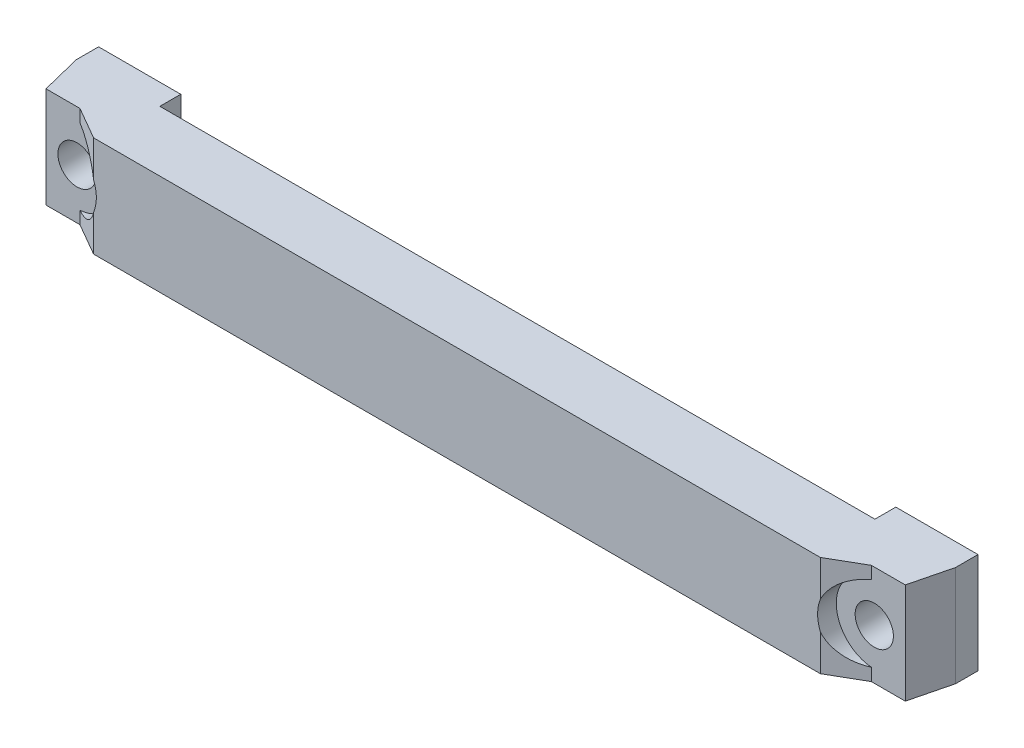
ISO-10303-21;
HEADER;
FILE_DESCRIPTION(('STEP AP214'),'2;1');
FILE_NAME('part.step','',(''),(''),'','','');
FILE_SCHEMA(('AUTOMOTIVE_DESIGN { 1 0 10303 214 1 1 1 1 }'));
ENDSEC;
DATA;
#1=APPLICATION_CONTEXT('core data for automotive mechanical design processes');
#2=APPLICATION_PROTOCOL_DEFINITION('international standard','automotive_design',2000,#1);
#3=PRODUCT_CONTEXT('',#1,'mechanical');
#4=PRODUCT('Part','Part','',(#3));
#5=PRODUCT_RELATED_PRODUCT_CATEGORY('part','',(#4));
#6=PRODUCT_DEFINITION_FORMATION('','',#4);
#7=PRODUCT_DEFINITION_CONTEXT('part definition',#1,'design');
#8=PRODUCT_DEFINITION('design','',#6,#7);
#9=PRODUCT_DEFINITION_SHAPE('','',#8);
#10=(LENGTH_UNIT() NAMED_UNIT(*) SI_UNIT(.MILLI.,.METRE.));
#11=(NAMED_UNIT(*) PLANE_ANGLE_UNIT() SI_UNIT($,.RADIAN.));
#12=(NAMED_UNIT(*) SI_UNIT($,.STERADIAN.) SOLID_ANGLE_UNIT());
#13=UNCERTAINTY_MEASURE_WITH_UNIT(LENGTH_MEASURE(1.E-05),#10,'distance_accuracy_value','');
#14=(GEOMETRIC_REPRESENTATION_CONTEXT(3) GLOBAL_UNCERTAINTY_ASSIGNED_CONTEXT((#13)) GLOBAL_UNIT_ASSIGNED_CONTEXT((#10,
#11,#12)) REPRESENTATION_CONTEXT('',''));
#15=CARTESIAN_POINT('',(0.,0.,0.));
#16=DIRECTION('',(0.,0.,1.));
#17=DIRECTION('',(1.,0.,0.));
#18=AXIS2_PLACEMENT_3D('',#15,#16,#17);
#19=CARTESIAN_POINT('',(0.,0.,-2.075));
#20=DIRECTION('',(0.,0.,-1.));
#21=DIRECTION('',(-1.,0.,0.));
#22=AXIS2_PLACEMENT_3D('',#19,#20,#21);
#23=PLANE('',#22);
#24=DIRECTION('',(0.,1.,0.));
#25=VECTOR('',#24,1.);
#26=CARTESIAN_POINT('',(0.,0.,-2.075));
#27=LINE('',#26,#25);
#28=CARTESIAN_POINT('',(0.,0.,-2.075));
#29=VERTEX_POINT('',#28);
#30=CARTESIAN_POINT('',(0.,10.,-2.075));
#31=VERTEX_POINT('',#30);
#32=EDGE_CURVE('E308',#29,#31,#27,.T.);
#33=ORIENTED_EDGE('',*,*,#32,.T.);
#34=DIRECTION('',(1.,0.,0.));
#35=VECTOR('',#34,1.);
#36=CARTESIAN_POINT('',(0.,10.,-2.075));
#37=LINE('',#36,#35);
#38=CARTESIAN_POINT('',(8.16,10.,-2.075));
#39=VERTEX_POINT('',#38);
#40=EDGE_CURVE('E311',#31,#39,#37,.T.);
#41=ORIENTED_EDGE('',*,*,#40,.T.);
#42=DIRECTION('',(0.,-1.,0.));
#43=VECTOR('',#42,1.);
#44=CARTESIAN_POINT('',(8.16,0.,-2.075));
#45=LINE('',#44,#43);
#46=CARTESIAN_POINT('',(8.16,0.,-2.075));
#47=VERTEX_POINT('',#46);
#48=EDGE_CURVE('E313',#39,#47,#45,.T.);
#49=ORIENTED_EDGE('',*,*,#48,.T.);
#50=DIRECTION('',(-1.,0.,0.));
#51=VECTOR('',#50,1.);
#52=CARTESIAN_POINT('',(0.,0.,-2.075));
#53=LINE('',#52,#51);
#54=EDGE_CURVE('E315',#47,#29,#53,.T.);
#55=ORIENTED_EDGE('',*,*,#54,.T.);
#56=EDGE_LOOP('',(#33,#41,#49,#55));
#57=FACE_BOUND('',#56,.T.);
#58=CARTESIAN_POINT('',(4.08,5.,-2.075));
#59=DIRECTION('',(0.,0.,1.));
#60=DIRECTION('',(1.,0.,0.));
#61=AXIS2_PLACEMENT_3D('',#58,#59,#60);
#62=CIRCLE('',#61,1.89865);
#63=CARTESIAN_POINT('',(5.97865,5.,-2.075));
#64=VERTEX_POINT('',#63);
#65=EDGE_CURVE('E174',#64,#64,#62,.T.);
#66=ORIENTED_EDGE('',*,*,#65,.T.);
#67=EDGE_LOOP('',(#66));
#68=FACE_BOUND('',#67,.T.);
#69=ADVANCED_FACE('F38',(#57,#68),#23,.T.);
#70=CARTESIAN_POINT('',(0.,0.,0.));
#71=DIRECTION('',(0.,0.,1.));
#72=DIRECTION('',(1.,0.,0.));
#73=AXIS2_PLACEMENT_3D('',#70,#71,#72);
#74=PLANE('',#73);
#75=DIRECTION('',(0.,1.,0.));
#76=VECTOR('',#75,1.);
#77=CARTESIAN_POINT('',(79.1605080756888,10.,0.));
#78=LINE('',#77,#76);
#79=CARTESIAN_POINT('',(79.1605080756888,0.,0.));
#80=VERTEX_POINT('',#79);
#81=CARTESIAN_POINT('',(79.1605080756888,10.,0.));
#82=VERTEX_POINT('',#81);
#83=EDGE_CURVE('E168',#80,#82,#78,.T.);
#84=ORIENTED_EDGE('',*,*,#83,.F.);
#85=DIRECTION('',(1.,0.,0.));
#86=VECTOR('',#85,1.);
#87=CARTESIAN_POINT('',(0.,0.,0.));
#88=LINE('',#87,#86);
#89=CARTESIAN_POINT('',(8.16,0.,0.));
#90=VERTEX_POINT('',#89);
#91=EDGE_CURVE('E179',#90,#80,#88,.T.);
#92=ORIENTED_EDGE('',*,*,#91,.F.);
#93=DIRECTION('',(0.,-1.,0.));
#94=VECTOR('',#93,1.);
#95=CARTESIAN_POINT('',(8.16,0.,0.));
#96=LINE('',#95,#94);
#97=CARTESIAN_POINT('',(8.16,10.,0.));
#98=VERTEX_POINT('',#97);
#99=EDGE_CURVE('E182',#98,#90,#96,.T.);
#100=ORIENTED_EDGE('',*,*,#99,.F.);
#101=DIRECTION('',(-1.,0.,0.));
#102=VECTOR('',#101,1.);
#103=CARTESIAN_POINT('',(0.,10.,0.));
#104=LINE('',#103,#102);
#105=EDGE_CURVE('E181',#82,#98,#104,.T.);
#106=ORIENTED_EDGE('',*,*,#105,.F.);
#107=EDGE_LOOP('',(#84,#92,#100,#106));
#108=FACE_BOUND('',#107,.T.);
#109=ADVANCED_FACE('F177',(#108),#74,.F.);
#110=CARTESIAN_POINT('',(0.,10.,6.));
#111=DIRECTION('',(1.,0.,0.));
#112=DIRECTION('',(0.,0.,-1.));
#113=AXIS2_PLACEMENT_3D('',#110,#111,#112);
#114=PLANE('',#113);
#115=DIRECTION('',(0.,0.,-1.));
#116=VECTOR('',#115,1.);
#117=CARTESIAN_POINT('',(0.,0.,6.));
#118=LINE('',#117,#116);
#119=CARTESIAN_POINT('',(0.,0.,0.145799999999942));
#120=VERTEX_POINT('',#119);
#121=EDGE_CURVE('E207',#120,#29,#118,.T.);
#122=ORIENTED_EDGE('',*,*,#121,.F.);
#123=DIRECTION('',(0.,1.,0.));
#124=VECTOR('',#123,1.);
#125=CARTESIAN_POINT('',(0.,10.,0.145799999999942));
#126=LINE('',#125,#124);
#127=CARTESIAN_POINT('',(0.,10.,0.145799999999942));
#128=VERTEX_POINT('',#127);
#129=EDGE_CURVE('E11',#120,#128,#126,.T.);
#130=ORIENTED_EDGE('',*,*,#129,.T.);
#131=DIRECTION('',(0.,0.,-1.));
#132=VECTOR('',#131,1.);
#133=CARTESIAN_POINT('',(0.,10.,6.));
#134=LINE('',#133,#132);
#135=EDGE_CURVE('E201',#128,#31,#134,.T.);
#136=ORIENTED_EDGE('',*,*,#135,.T.);
#137=ORIENTED_EDGE('',*,*,#32,.F.);
#138=EDGE_LOOP('',(#122,#130,#136,#137));
#139=FACE_BOUND('',#138,.T.);
#140=ADVANCED_FACE('F378',(#139),#114,.F.);
#141=CARTESIAN_POINT('',(0.,0.,6.));
#142=DIRECTION('',(0.,1.,0.));
#143=DIRECTION('',(0.,0.,1.));
#144=AXIS2_PLACEMENT_3D('',#141,#142,#143);
#145=PLANE('',#144);
#146=DIRECTION('',(0.,0.,-1.));
#147=VECTOR('',#146,1.);
#148=CARTESIAN_POINT('',(87.3205080756888,0.,6.));
#149=LINE('',#148,#147);
#150=CARTESIAN_POINT('',(87.3205080756888,0.,0.145799999999929));
#151=VERTEX_POINT('',#150);
#152=CARTESIAN_POINT('',(87.3205080756888,0.,-2.075));
#153=VERTEX_POINT('',#152);
#154=EDGE_CURVE('E205',#151,#153,#149,.T.);
#155=ORIENTED_EDGE('',*,*,#154,.F.);
#156=DIRECTION('',(0.242535625036329,0.,-0.970142500145333));
#157=VECTOR('',#156,1.);
#158=CARTESIAN_POINT('',(86.3205080756888,0.,4.1458));
#159=LINE('',#158,#157);
#160=CARTESIAN_POINT('',(86.3205080756888,0.,4.1458));
#161=VERTEX_POINT('',#160);
#162=EDGE_CURVE('E259',#151,#161,#159,.F.);
#163=ORIENTED_EDGE('',*,*,#162,.T.);
#164=DIRECTION('',(1.,0.,0.));
#165=VECTOR('',#164,1.);
#166=CARTESIAN_POINT('',(87.3205080756888,0.,4.1458));
#167=LINE('',#166,#165);
#168=CARTESIAN_POINT('',(82.9520766830829,0.,4.1458));
#169=VERTEX_POINT('',#168);
#170=EDGE_CURVE('E272',#169,#161,#167,.T.);
#171=ORIENTED_EDGE('',*,*,#170,.F.);
#172=DIRECTION('',(-0.866025403784436,0.,0.500000000000005));
#173=VECTOR('',#172,1.);
#174=CARTESIAN_POINT('',(83.2405080756888,0.,3.97927405783627));
#175=LINE('',#174,#173);
#176=CARTESIAN_POINT('',(79.7405080756888,0.,6.));
#177=VERTEX_POINT('',#176);
#178=EDGE_CURVE('E212',#169,#177,#175,.T.);
#179=ORIENTED_EDGE('',*,*,#178,.T.);
#180=DIRECTION('',(1.,0.,0.));
#181=VECTOR('',#180,1.);
#182=CARTESIAN_POINT('',(0.,0.,6.));
#183=LINE('',#182,#181);
#184=CARTESIAN_POINT('',(7.58000000000001,0.,6.));
#185=VERTEX_POINT('',#184);
#186=EDGE_CURVE('E193',#185,#177,#183,.T.);
#187=ORIENTED_EDGE('',*,*,#186,.F.);
#188=DIRECTION('',(-0.866025403784435,0.,-0.500000000000006));
#189=VECTOR('',#188,1.);
#190=CARTESIAN_POINT('',(4.08,0.,3.97927405783627));
#191=LINE('',#190,#189);
#192=CARTESIAN_POINT('',(4.36843139260585,0.,4.1458));
#193=VERTEX_POINT('',#192);
#194=EDGE_CURVE('E209',#185,#193,#191,.T.);
#195=ORIENTED_EDGE('',*,*,#194,.T.);
#196=DIRECTION('',(1.,0.,0.));
#197=VECTOR('',#196,1.);
#198=CARTESIAN_POINT('',(0.,0.,4.1458));
#199=LINE('',#198,#197);
#200=CARTESIAN_POINT('',(1.,0.,4.1458));
#201=VERTEX_POINT('',#200);
#202=EDGE_CURVE('E263',#201,#193,#199,.T.);
#203=ORIENTED_EDGE('',*,*,#202,.F.);
#204=DIRECTION('',(0.24253562503633,0.,0.970142500145333));
#205=VECTOR('',#204,1.);
#206=CARTESIAN_POINT('',(1.,0.,4.1458));
#207=LINE('',#206,#205);
#208=EDGE_CURVE('E54',#201,#120,#207,.F.);
#209=ORIENTED_EDGE('',*,*,#208,.T.);
#210=ORIENTED_EDGE('',*,*,#121,.T.);
#211=ORIENTED_EDGE('',*,*,#54,.F.);
#212=DIRECTION('',(0.,0.,1.));
#213=VECTOR('',#212,1.);
#214=CARTESIAN_POINT('',(8.16,0.,-2.075));
#215=LINE('',#214,#213);
#216=EDGE_CURVE('E190',#47,#90,#215,.T.);
#217=ORIENTED_EDGE('',*,*,#216,.T.);
#218=ORIENTED_EDGE('',*,*,#91,.T.);
#219=DIRECTION('',(0.,0.,1.));
#220=VECTOR('',#219,1.);
#221=CARTESIAN_POINT('',(79.1605080756888,0.,-2.075));
#222=LINE('',#221,#220);
#223=CARTESIAN_POINT('',(79.1605080756888,0.,-2.075));
#224=VERTEX_POINT('',#223);
#225=EDGE_CURVE('E164',#224,#80,#222,.T.);
#226=ORIENTED_EDGE('',*,*,#225,.F.);
#227=DIRECTION('',(-1.,0.,0.));
#228=VECTOR('',#227,1.);
#229=CARTESIAN_POINT('',(87.3205080756888,0.,-2.075));
#230=LINE('',#229,#228);
#231=EDGE_CURVE('E304',#153,#224,#230,.T.);
#232=ORIENTED_EDGE('',*,*,#231,.F.);
#233=EDGE_LOOP('',(#155,#163,#171,#179,#187,#195,#203,#209,#210,#211,#217,#218,#226,#232));
#234=FACE_BOUND('',#233,.T.);
#235=ADVANCED_FACE('F187',(#234),#145,.F.);
#236=CARTESIAN_POINT('',(87.3205080756888,10.,6.));
#237=DIRECTION('',(-1.,0.,0.));
#238=DIRECTION('',(0.,0.,1.));
#239=AXIS2_PLACEMENT_3D('',#236,#237,#238);
#240=PLANE('',#239);
#241=DIRECTION('',(0.,0.,-1.));
#242=VECTOR('',#241,1.);
#243=CARTESIAN_POINT('',(87.3205080756888,10.,6.));
#244=LINE('',#243,#242);
#245=CARTESIAN_POINT('',(87.3205080756888,10.,0.145799999999929));
#246=VERTEX_POINT('',#245);
#247=CARTESIAN_POINT('',(87.3205080756888,10.,-2.075));
#248=VERTEX_POINT('',#247);
#249=EDGE_CURVE('E203',#246,#248,#244,.T.);
#250=ORIENTED_EDGE('',*,*,#249,.F.);
#251=DIRECTION('',(0.,-1.,0.));
#252=VECTOR('',#251,1.);
#253=CARTESIAN_POINT('',(87.3205080756888,10.,0.145799999999929));
#254=LINE('',#253,#252);
#255=EDGE_CURVE('E256',#246,#151,#254,.T.);
#256=ORIENTED_EDGE('',*,*,#255,.T.);
#257=ORIENTED_EDGE('',*,*,#154,.T.);
#258=DIRECTION('',(0.,-1.,0.));
#259=VECTOR('',#258,1.);
#260=CARTESIAN_POINT('',(87.3205080756888,10.,-2.075));
#261=LINE('',#260,#259);
#262=EDGE_CURVE('E183',#248,#153,#261,.T.);
#263=ORIENTED_EDGE('',*,*,#262,.F.);
#264=EDGE_LOOP('',(#250,#256,#257,#263));
#265=FACE_BOUND('',#264,.T.);
#266=ADVANCED_FACE('F363',(#265),#240,.F.);
#267=CARTESIAN_POINT('',(0.,10.,6.));
#268=DIRECTION('',(0.,-1.,0.));
#269=DIRECTION('',(0.,0.,-1.));
#270=AXIS2_PLACEMENT_3D('',#267,#268,#269);
#271=PLANE('',#270);
#272=DIRECTION('',(-1.,0.,0.));
#273=VECTOR('',#272,1.);
#274=CARTESIAN_POINT('',(87.3205080756888,10.,4.1458));
#275=LINE('',#274,#273);
#276=CARTESIAN_POINT('',(86.3205080756888,10.,4.1458));
#277=VERTEX_POINT('',#276);
#278=CARTESIAN_POINT('',(82.9520766830829,10.,4.1458));
#279=VERTEX_POINT('',#278);
#280=EDGE_CURVE('E268',#277,#279,#275,.T.);
#281=ORIENTED_EDGE('',*,*,#280,.F.);
#282=DIRECTION('',(-0.242535625036329,0.,0.970142500145333));
#283=VECTOR('',#282,1.);
#284=CARTESIAN_POINT('',(86.3205080756888,10.,4.1458));
#285=LINE('',#284,#283);
#286=EDGE_CURVE('E254',#277,#246,#285,.F.);
#287=ORIENTED_EDGE('',*,*,#286,.T.);
#288=ORIENTED_EDGE('',*,*,#249,.T.);
#289=DIRECTION('',(1.,0.,0.));
#290=VECTOR('',#289,1.);
#291=CARTESIAN_POINT('',(87.3205080756888,10.,-2.075));
#292=LINE('',#291,#290);
#293=CARTESIAN_POINT('',(79.1605080756888,10.,-2.075));
#294=VERTEX_POINT('',#293);
#295=EDGE_CURVE('E299',#294,#248,#292,.T.);
#296=ORIENTED_EDGE('',*,*,#295,.F.);
#297=DIRECTION('',(0.,0.,1.));
#298=VECTOR('',#297,1.);
#299=CARTESIAN_POINT('',(79.1605080756888,10.,-2.075));
#300=LINE('',#299,#298);
#301=EDGE_CURVE('E173',#294,#82,#300,.T.);
#302=ORIENTED_EDGE('',*,*,#301,.T.);
#303=ORIENTED_EDGE('',*,*,#105,.T.);
#304=DIRECTION('',(0.,0.,1.));
#305=VECTOR('',#304,1.);
#306=CARTESIAN_POINT('',(8.16,10.,-2.075));
#307=LINE('',#306,#305);
#308=EDGE_CURVE('E191',#39,#98,#307,.T.);
#309=ORIENTED_EDGE('',*,*,#308,.F.);
#310=ORIENTED_EDGE('',*,*,#40,.F.);
#311=ORIENTED_EDGE('',*,*,#135,.F.);
#312=DIRECTION('',(-0.24253562503633,0.,-0.970142500145333));
#313=VECTOR('',#312,1.);
#314=CARTESIAN_POINT('',(1.,10.,4.1458));
#315=LINE('',#314,#313);
#316=CARTESIAN_POINT('',(1.,10.,4.1458));
#317=VERTEX_POINT('',#316);
#318=EDGE_CURVE('E252',#128,#317,#315,.F.);
#319=ORIENTED_EDGE('',*,*,#318,.T.);
#320=DIRECTION('',(-1.,0.,0.));
#321=VECTOR('',#320,1.);
#322=CARTESIAN_POINT('',(0.,10.,4.1458));
#323=LINE('',#322,#321);
#324=CARTESIAN_POINT('',(4.36843139260585,10.,4.1458));
#325=VERTEX_POINT('',#324);
#326=EDGE_CURVE('E264',#325,#317,#323,.T.);
#327=ORIENTED_EDGE('',*,*,#326,.F.);
#328=DIRECTION('',(0.866025403784435,0.,0.500000000000006));
#329=VECTOR('',#328,1.);
#330=CARTESIAN_POINT('',(4.08,10.,3.97927405783627));
#331=LINE('',#330,#329);
#332=CARTESIAN_POINT('',(7.58000000000001,10.,6.));
#333=VERTEX_POINT('',#332);
#334=EDGE_CURVE('E230',#325,#333,#331,.T.);
#335=ORIENTED_EDGE('',*,*,#334,.T.);
#336=DIRECTION('',(-1.,0.,0.));
#337=VECTOR('',#336,1.);
#338=CARTESIAN_POINT('',(0.,10.,6.));
#339=LINE('',#338,#337);
#340=CARTESIAN_POINT('',(79.7405080756888,10.,6.));
#341=VERTEX_POINT('',#340);
#342=EDGE_CURVE('E198',#341,#333,#339,.T.);
#343=ORIENTED_EDGE('',*,*,#342,.F.);
#344=DIRECTION('',(0.866025403784436,0.,-0.500000000000005));
#345=VECTOR('',#344,1.);
#346=CARTESIAN_POINT('',(83.2405080756888,10.,3.97927405783627));
#347=LINE('',#346,#345);
#348=EDGE_CURVE('E232',#341,#279,#347,.T.);
#349=ORIENTED_EDGE('',*,*,#348,.T.);
#350=EDGE_LOOP('',(#281,#287,#288,#296,#302,#303,#309,#310,#311,#319,#327,#335,#343,#349));
#351=FACE_BOUND('',#350,.T.);
#352=ADVANCED_FACE('F353',(#351),#271,.F.);
#353=CARTESIAN_POINT('',(0.,0.,6.));
#354=DIRECTION('',(0.,0.,1.));
#355=DIRECTION('',(1.,0.,0.));
#356=AXIS2_PLACEMENT_3D('',#353,#354,#355);
#357=PLANE('',#356);
#358=ORIENTED_EDGE('',*,*,#186,.T.);
#359=DIRECTION('',(0.,1.,0.));
#360=VECTOR('',#359,1.);
#361=CARTESIAN_POINT('',(79.7405080756888,1.22937,6.));
#362=LINE('',#361,#360);
#363=CARTESIAN_POINT('',(79.7405080756888,3.59727030511939,6.));
#364=VERTEX_POINT('',#363);
#365=EDGE_CURVE('E223',#177,#364,#362,.T.);
#366=ORIENTED_EDGE('',*,*,#365,.T.);
#367=CARTESIAN_POINT('',(83.2405080756888,5.,6.));
#368=DIRECTION('',(0.,0.,1.));
#369=DIRECTION('',(1.,0.,0.));
#370=AXIS2_PLACEMENT_3D('',#367,#368,#369);
#371=CIRCLE('',#370,3.77063);
#372=CARTESIAN_POINT('',(79.7405080756888,6.40272969488061,6.));
#373=VERTEX_POINT('',#372);
#374=EDGE_CURVE('E270',#373,#364,#371,.T.);
#375=ORIENTED_EDGE('',*,*,#374,.F.);
#376=DIRECTION('',(0.,1.,0.));
#377=VECTOR('',#376,1.);
#378=CARTESIAN_POINT('',(79.7405080756888,10.,6.));
#379=LINE('',#378,#377);
#380=EDGE_CURVE('E220',#373,#341,#379,.T.);
#381=ORIENTED_EDGE('',*,*,#380,.T.);
#382=ORIENTED_EDGE('',*,*,#342,.T.);
#383=DIRECTION('',(0.,-1.,0.));
#384=VECTOR('',#383,1.);
#385=CARTESIAN_POINT('',(7.58000000000001,8.77063,6.));
#386=LINE('',#385,#384);
#387=CARTESIAN_POINT('',(7.58000000000001,6.40272969488063,6.));
#388=VERTEX_POINT('',#387);
#389=EDGE_CURVE('E214',#333,#388,#386,.T.);
#390=ORIENTED_EDGE('',*,*,#389,.T.);
#391=CARTESIAN_POINT('',(4.08,5.,6.));
#392=DIRECTION('',(0.,0.,1.));
#393=DIRECTION('',(1.,0.,0.));
#394=AXIS2_PLACEMENT_3D('',#391,#392,#393);
#395=CIRCLE('',#394,3.77063);
#396=CARTESIAN_POINT('',(7.58000000000001,3.59727030511937,6.));
#397=VERTEX_POINT('',#396);
#398=EDGE_CURVE('E288',#397,#388,#395,.T.);
#399=ORIENTED_EDGE('',*,*,#398,.F.);
#400=DIRECTION('',(0.,-1.,0.));
#401=VECTOR('',#400,1.);
#402=CARTESIAN_POINT('',(7.58000000000001,0.,6.));
#403=LINE('',#402,#401);
#404=EDGE_CURVE('E217',#397,#185,#403,.T.);
#405=ORIENTED_EDGE('',*,*,#404,.T.);
#406=EDGE_LOOP('',(#358,#366,#375,#381,#382,#390,#399,#405));
#407=FACE_BOUND('',#406,.T.);
#408=ADVANCED_FACE('F325',(#407),#357,.T.);
#409=CARTESIAN_POINT('',(8.16,0.,-2.075));
#410=DIRECTION('',(-1.,0.,0.));
#411=DIRECTION('',(0.,0.,1.));
#412=AXIS2_PLACEMENT_3D('',#409,#410,#411);
#413=PLANE('',#412);
#414=ORIENTED_EDGE('',*,*,#99,.T.);
#415=ORIENTED_EDGE('',*,*,#216,.F.);
#416=ORIENTED_EDGE('',*,*,#48,.F.);
#417=ORIENTED_EDGE('',*,*,#308,.T.);
#418=EDGE_LOOP('',(#414,#415,#416,#417));
#419=FACE_BOUND('',#418,.T.);
#420=ADVANCED_FACE('F372',(#419),#413,.F.);
#421=CARTESIAN_POINT('',(79.1605080756888,10.,-2.075));
#422=DIRECTION('',(1.,0.,0.));
#423=DIRECTION('',(0.,0.,-1.));
#424=AXIS2_PLACEMENT_3D('',#421,#422,#423);
#425=PLANE('',#424);
#426=ORIENTED_EDGE('',*,*,#83,.T.);
#427=ORIENTED_EDGE('',*,*,#301,.F.);
#428=DIRECTION('',(0.,1.,0.));
#429=VECTOR('',#428,1.);
#430=CARTESIAN_POINT('',(79.1605080756888,10.,-2.075));
#431=LINE('',#430,#429);
#432=EDGE_CURVE('E170',#224,#294,#431,.T.);
#433=ORIENTED_EDGE('',*,*,#432,.F.);
#434=ORIENTED_EDGE('',*,*,#225,.T.);
#435=EDGE_LOOP('',(#426,#427,#433,#434));
#436=FACE_BOUND('',#435,.T.);
#437=ADVANCED_FACE('F166',(#436),#425,.F.);
#438=CARTESIAN_POINT('',(0.,0.,-2.075));
#439=DIRECTION('',(0.,0.,-1.));
#440=DIRECTION('',(-1.,0.,0.));
#441=AXIS2_PLACEMENT_3D('',#438,#439,#440);
#442=PLANE('',#441);
#443=CARTESIAN_POINT('',(83.2405080756888,5.,-2.075));
#444=DIRECTION('',(0.,0.,1.));
#445=DIRECTION('',(1.,0.,0.));
#446=AXIS2_PLACEMENT_3D('',#443,#444,#445);
#447=CIRCLE('',#446,1.89865);
#448=CARTESIAN_POINT('',(85.1391580756888,5.,-2.075));
#449=VERTEX_POINT('',#448);
#450=EDGE_CURVE('E285',#449,#449,#447,.T.);
#451=ORIENTED_EDGE('',*,*,#450,.T.);
#452=EDGE_LOOP('',(#451));
#453=FACE_BOUND('',#452,.T.);
#454=ORIENTED_EDGE('',*,*,#262,.T.);
#455=ORIENTED_EDGE('',*,*,#231,.T.);
#456=ORIENTED_EDGE('',*,*,#432,.T.);
#457=ORIENTED_EDGE('',*,*,#295,.T.);
#458=EDGE_LOOP('',(#454,#455,#456,#457));
#459=FACE_BOUND('',#458,.T.);
#460=ADVANCED_FACE('F366',(#453,#459),#442,.T.);
#461=CARTESIAN_POINT('',(4.08,5.,6.));
#462=DIRECTION('',(0.,0.,1.));
#463=DIRECTION('',(1.,0.,0.));
#464=AXIS2_PLACEMENT_3D('',#461,#462,#463);
#465=CYLINDRICAL_SURFACE('',#464,1.89865);
#466=ORIENTED_EDGE('',*,*,#65,.F.);
#467=EDGE_LOOP('',(#466));
#468=FACE_BOUND('',#467,.T.);
#469=CARTESIAN_POINT('',(4.08,5.,4.1458));
#470=DIRECTION('',(0.,0.,1.));
#471=DIRECTION('',(1.,0.,0.));
#472=AXIS2_PLACEMENT_3D('',#469,#470,#471);
#473=CIRCLE('',#472,1.89865);
#474=CARTESIAN_POINT('',(5.97865,5.,4.1458));
#475=VERTEX_POINT('',#474);
#476=EDGE_CURVE('E294',#475,#475,#473,.T.);
#477=ORIENTED_EDGE('',*,*,#476,.T.);
#478=EDGE_LOOP('',(#477));
#479=FACE_BOUND('',#478,.T.);
#480=ADVANCED_FACE('F433',(#468,#479),#465,.F.);
#481=CARTESIAN_POINT('',(5.97865,5.,4.1458));
#482=DIRECTION('',(0.,0.,-1.));
#483=DIRECTION('',(-1.,0.,0.));
#484=AXIS2_PLACEMENT_3D('',#481,#482,#483);
#485=PLANE('',#484);
#486=ORIENTED_EDGE('',*,*,#476,.F.);
#487=EDGE_LOOP('',(#486));
#488=FACE_BOUND('',#487,.T.);
#489=ORIENTED_EDGE('',*,*,#326,.T.);
#490=DIRECTION('',(0.,-1.,0.));
#491=VECTOR('',#490,1.);
#492=CARTESIAN_POINT('',(1.,5.,4.1458));
#493=LINE('',#492,#491);
#494=EDGE_CURVE('E47',#317,#201,#493,.T.);
#495=ORIENTED_EDGE('',*,*,#494,.T.);
#496=ORIENTED_EDGE('',*,*,#202,.T.);
#497=DIRECTION('',(0.,1.,0.));
#498=VECTOR('',#497,1.);
#499=CARTESIAN_POINT('',(4.36843139260585,5.,4.1458));
#500=LINE('',#499,#498);
#501=CARTESIAN_POINT('',(4.36843139260585,1.24041785185382,4.1458));
#502=VERTEX_POINT('',#501);
#503=EDGE_CURVE('E244',#193,#502,#500,.T.);
#504=ORIENTED_EDGE('',*,*,#503,.T.);
#505=CARTESIAN_POINT('',(4.08,5.,4.1458));
#506=DIRECTION('',(0.,0.,1.));
#507=DIRECTION('',(1.,0.,0.));
#508=AXIS2_PLACEMENT_3D('',#505,#506,#507);
#509=CIRCLE('',#508,3.77063);
#510=CARTESIAN_POINT('',(4.36843139260585,8.75958214814618,4.1458));
#511=VERTEX_POINT('',#510);
#512=EDGE_CURVE('E291',#502,#511,#509,.T.);
#513=ORIENTED_EDGE('',*,*,#512,.T.);
#514=DIRECTION('',(0.,1.,0.));
#515=VECTOR('',#514,1.);
#516=CARTESIAN_POINT('',(4.36843139260585,5.,4.1458));
#517=LINE('',#516,#515);
#518=EDGE_CURVE('E246',#511,#325,#517,.T.);
#519=ORIENTED_EDGE('',*,*,#518,.T.);
#520=EDGE_LOOP('',(#489,#495,#496,#504,#513,#519));
#521=FACE_BOUND('',#520,.T.);
#522=ADVANCED_FACE('F262',(#488,#521),#485,.F.);
#523=CARTESIAN_POINT('',(4.08,5.,6.));
#524=DIRECTION('',(0.,0.,1.));
#525=DIRECTION('',(1.,0.,0.));
#526=AXIS2_PLACEMENT_3D('',#523,#524,#525);
#527=CYLINDRICAL_SURFACE('',#526,3.77063);
#528=ORIENTED_EDGE('',*,*,#512,.F.);
#529=CARTESIAN_POINT('',(4.08,5.,3.97927405783627));
#530=DIRECTION('',(-0.500000000000006,0.,0.866025403784435));
#531=DIRECTION('',(0.866025403784435,0.,0.500000000000006));
#532=AXIS2_PLACEMENT_3D('',#529,#530,#531);
#533=ELLIPSE('',#532,4.35394849102897,3.77063);
#534=EDGE_CURVE('E237',#502,#397,#533,.T.);
#535=ORIENTED_EDGE('',*,*,#534,.T.);
#536=ORIENTED_EDGE('',*,*,#398,.T.);
#537=CARTESIAN_POINT('',(4.08,5.,3.97927405783627));
#538=DIRECTION('',(-0.500000000000006,0.,0.866025403784435));
#539=DIRECTION('',(0.866025403784435,0.,0.500000000000006));
#540=AXIS2_PLACEMENT_3D('',#537,#538,#539);
#541=ELLIPSE('',#540,4.35394849102897,3.77063);
#542=EDGE_CURVE('E235',#388,#511,#541,.T.);
#543=ORIENTED_EDGE('',*,*,#542,.T.);
#544=EDGE_LOOP('',(#528,#535,#536,#543));
#545=FACE_BOUND('',#544,.T.);
#546=ADVANCED_FACE('F336',(#545),#527,.F.);
#547=CARTESIAN_POINT('',(83.2405080756888,5.,6.));
#548=DIRECTION('',(0.,0.,1.));
#549=DIRECTION('',(1.,0.,0.));
#550=AXIS2_PLACEMENT_3D('',#547,#548,#549);
#551=CYLINDRICAL_SURFACE('',#550,1.89865);
#552=ORIENTED_EDGE('',*,*,#450,.F.);
#553=EDGE_LOOP('',(#552));
#554=FACE_BOUND('',#553,.T.);
#555=CARTESIAN_POINT('',(83.2405080756888,5.,4.1458));
#556=DIRECTION('',(0.,0.,1.));
#557=DIRECTION('',(1.,0.,0.));
#558=AXIS2_PLACEMENT_3D('',#555,#556,#557);
#559=CIRCLE('',#558,1.89865);
#560=CARTESIAN_POINT('',(85.1391580756888,5.,4.1458));
#561=VERTEX_POINT('',#560);
#562=EDGE_CURVE('E282',#561,#561,#559,.T.);
#563=ORIENTED_EDGE('',*,*,#562,.T.);
#564=EDGE_LOOP('',(#563));
#565=FACE_BOUND('',#564,.T.);
#566=ADVANCED_FACE('F453',(#554,#565),#551,.F.);
#567=CARTESIAN_POINT('',(85.1391580756888,5.,4.1458));
#568=DIRECTION('',(0.,0.,-1.));
#569=DIRECTION('',(-1.,0.,0.));
#570=AXIS2_PLACEMENT_3D('',#567,#568,#569);
#571=PLANE('',#570);
#572=ORIENTED_EDGE('',*,*,#562,.F.);
#573=EDGE_LOOP('',(#572));
#574=FACE_BOUND('',#573,.T.);
#575=ORIENTED_EDGE('',*,*,#170,.T.);
#576=DIRECTION('',(0.,1.,0.));
#577=VECTOR('',#576,1.);
#578=CARTESIAN_POINT('',(86.3205080756888,5.,4.1458));
#579=LINE('',#578,#577);
#580=EDGE_CURVE('E249',#161,#277,#579,.T.);
#581=ORIENTED_EDGE('',*,*,#580,.T.);
#582=ORIENTED_EDGE('',*,*,#280,.T.);
#583=DIRECTION('',(0.,-1.,0.));
#584=VECTOR('',#583,1.);
#585=CARTESIAN_POINT('',(82.9520766830829,5.,4.1458));
#586=LINE('',#585,#584);
#587=CARTESIAN_POINT('',(82.9520766830829,8.75958214814618,4.1458));
#588=VERTEX_POINT('',#587);
#589=EDGE_CURVE('E242',#279,#588,#586,.T.);
#590=ORIENTED_EDGE('',*,*,#589,.T.);
#591=CARTESIAN_POINT('',(83.2405080756888,5.,4.1458));
#592=DIRECTION('',(0.,0.,1.));
#593=DIRECTION('',(1.,0.,0.));
#594=AXIS2_PLACEMENT_3D('',#591,#592,#593);
#595=CIRCLE('',#594,3.77063);
#596=CARTESIAN_POINT('',(82.9520766830829,1.24041785185382,4.1458));
#597=VERTEX_POINT('',#596);
#598=EDGE_CURVE('E279',#588,#597,#595,.T.);
#599=ORIENTED_EDGE('',*,*,#598,.T.);
#600=DIRECTION('',(0.,-1.,0.));
#601=VECTOR('',#600,1.);
#602=CARTESIAN_POINT('',(82.9520766830829,5.,4.1458));
#603=LINE('',#602,#601);
#604=EDGE_CURVE('E239',#597,#169,#603,.T.);
#605=ORIENTED_EDGE('',*,*,#604,.T.);
#606=EDGE_LOOP('',(#575,#581,#582,#590,#599,#605));
#607=FACE_BOUND('',#606,.T.);
#608=ADVANCED_FACE('F356',(#574,#607),#571,.F.);
#609=CARTESIAN_POINT('',(83.2405080756888,5.,6.));
#610=DIRECTION('',(0.,0.,1.));
#611=DIRECTION('',(1.,0.,0.));
#612=AXIS2_PLACEMENT_3D('',#609,#610,#611);
#613=CYLINDRICAL_SURFACE('',#612,3.77063);
#614=ORIENTED_EDGE('',*,*,#374,.T.);
#615=CARTESIAN_POINT('',(83.2405080756888,5.,3.97927405783627));
#616=DIRECTION('',(0.500000000000005,0.,0.866025403784436));
#617=DIRECTION('',(-0.866025403784436,0.,0.500000000000005));
#618=AXIS2_PLACEMENT_3D('',#615,#616,#617);
#619=ELLIPSE('',#618,4.35394849102897,3.77063);
#620=EDGE_CURVE('E228',#364,#597,#619,.T.);
#621=ORIENTED_EDGE('',*,*,#620,.T.);
#622=ORIENTED_EDGE('',*,*,#598,.F.);
#623=CARTESIAN_POINT('',(83.2405080756888,5.,3.97927405783627));
#624=DIRECTION('',(0.500000000000005,0.,0.866025403784436));
#625=DIRECTION('',(-0.866025403784436,0.,0.500000000000005));
#626=AXIS2_PLACEMENT_3D('',#623,#624,#625);
#627=ELLIPSE('',#626,4.35394849102897,3.77063);
#628=EDGE_CURVE('E226',#588,#373,#627,.T.);
#629=ORIENTED_EDGE('',*,*,#628,.T.);
#630=EDGE_LOOP('',(#614,#621,#622,#629));
#631=FACE_BOUND('',#630,.T.);
#632=ADVANCED_FACE('F346',(#631),#613,.F.);
#633=CARTESIAN_POINT('',(83.2405080756888,10.,3.97927405783627));
#634=DIRECTION('',(0.500000000000005,0.,0.866025403784436));
#635=DIRECTION('',(0.,1.,0.));
#636=AXIS2_PLACEMENT_3D('',#633,#634,#635);
#637=PLANE('',#636);
#638=ORIENTED_EDGE('',*,*,#620,.F.);
#639=ORIENTED_EDGE('',*,*,#365,.F.);
#640=ORIENTED_EDGE('',*,*,#178,.F.);
#641=ORIENTED_EDGE('',*,*,#604,.F.);
#642=EDGE_LOOP('',(#638,#639,#640,#641));
#643=FACE_BOUND('',#642,.T.);
#644=ADVANCED_FACE('F344',(#643),#637,.T.);
#645=CARTESIAN_POINT('',(83.2405080756888,10.,3.97927405783627));
#646=DIRECTION('',(0.500000000000005,0.,0.866025403784436));
#647=DIRECTION('',(0.,1.,0.));
#648=AXIS2_PLACEMENT_3D('',#645,#646,#647);
#649=PLANE('',#648);
#650=ORIENTED_EDGE('',*,*,#348,.F.);
#651=ORIENTED_EDGE('',*,*,#380,.F.);
#652=ORIENTED_EDGE('',*,*,#628,.F.);
#653=ORIENTED_EDGE('',*,*,#589,.F.);
#654=EDGE_LOOP('',(#650,#651,#652,#653));
#655=FACE_BOUND('',#654,.T.);
#656=ADVANCED_FACE('F351',(#655),#649,.T.);
#657=CARTESIAN_POINT('',(4.08,10.,3.97927405783627));
#658=DIRECTION('',(-0.500000000000006,0.,0.866025403784435));
#659=DIRECTION('',(0.,-1.,0.));
#660=AXIS2_PLACEMENT_3D('',#657,#658,#659);
#661=PLANE('',#660);
#662=ORIENTED_EDGE('',*,*,#194,.F.);
#663=ORIENTED_EDGE('',*,*,#404,.F.);
#664=ORIENTED_EDGE('',*,*,#534,.F.);
#665=ORIENTED_EDGE('',*,*,#503,.F.);
#666=EDGE_LOOP('',(#662,#663,#664,#665));
#667=FACE_BOUND('',#666,.T.);
#668=ADVANCED_FACE('F339',(#667),#661,.T.);
#669=CARTESIAN_POINT('',(4.08,10.,3.97927405783627));
#670=DIRECTION('',(-0.500000000000006,0.,0.866025403784435));
#671=DIRECTION('',(0.,-1.,0.));
#672=AXIS2_PLACEMENT_3D('',#669,#670,#671);
#673=PLANE('',#672);
#674=ORIENTED_EDGE('',*,*,#542,.F.);
#675=ORIENTED_EDGE('',*,*,#389,.F.);
#676=ORIENTED_EDGE('',*,*,#334,.F.);
#677=ORIENTED_EDGE('',*,*,#518,.F.);
#678=EDGE_LOOP('',(#674,#675,#676,#677));
#679=FACE_BOUND('',#678,.T.);
#680=ADVANCED_FACE('F332',(#679),#673,.T.);
#681=CARTESIAN_POINT('',(86.3205080756888,5.,4.1458));
#682=DIRECTION('',(-0.970142500145333,0.,-0.242535625036329));
#683=DIRECTION('',(0.,1.,0.));
#684=AXIS2_PLACEMENT_3D('',#681,#682,#683);
#685=PLANE('',#684);
#686=ORIENTED_EDGE('',*,*,#162,.F.);
#687=ORIENTED_EDGE('',*,*,#255,.F.);
#688=ORIENTED_EDGE('',*,*,#286,.F.);
#689=ORIENTED_EDGE('',*,*,#580,.F.);
#690=EDGE_LOOP('',(#686,#687,#688,#689));
#691=FACE_BOUND('',#690,.T.);
#692=ADVANCED_FACE('F360',(#691),#685,.F.);
#693=CARTESIAN_POINT('',(1.,5.,4.1458));
#694=DIRECTION('',(0.970142500145333,0.,-0.24253562503633));
#695=DIRECTION('',(0.,-1.,0.));
#696=AXIS2_PLACEMENT_3D('',#693,#694,#695);
#697=PLANE('',#696);
#698=ORIENTED_EDGE('',*,*,#318,.F.);
#699=ORIENTED_EDGE('',*,*,#129,.F.);
#700=ORIENTED_EDGE('',*,*,#208,.F.);
#701=ORIENTED_EDGE('',*,*,#494,.F.);
#702=EDGE_LOOP('',(#698,#699,#700,#701));
#703=FACE_BOUND('',#702,.T.);
#704=ADVANCED_FACE('F41',(#703),#697,.F.);
#705=CLOSED_SHELL('',(#69,#109,#140,#235,#266,#352,#408,#420,#437,#460,#480,#522,#546,#566,#608,
#632,#644,#656,#668,#680,#692,#704));
#706=MANIFOLD_SOLID_BREP('B2',#705);
#707=ADVANCED_BREP_SHAPE_REPRESENTATION('',(#18,#706),#14);
#708=SHAPE_DEFINITION_REPRESENTATION(#9,#707);
ENDSEC;
END-ISO-10303-21;
